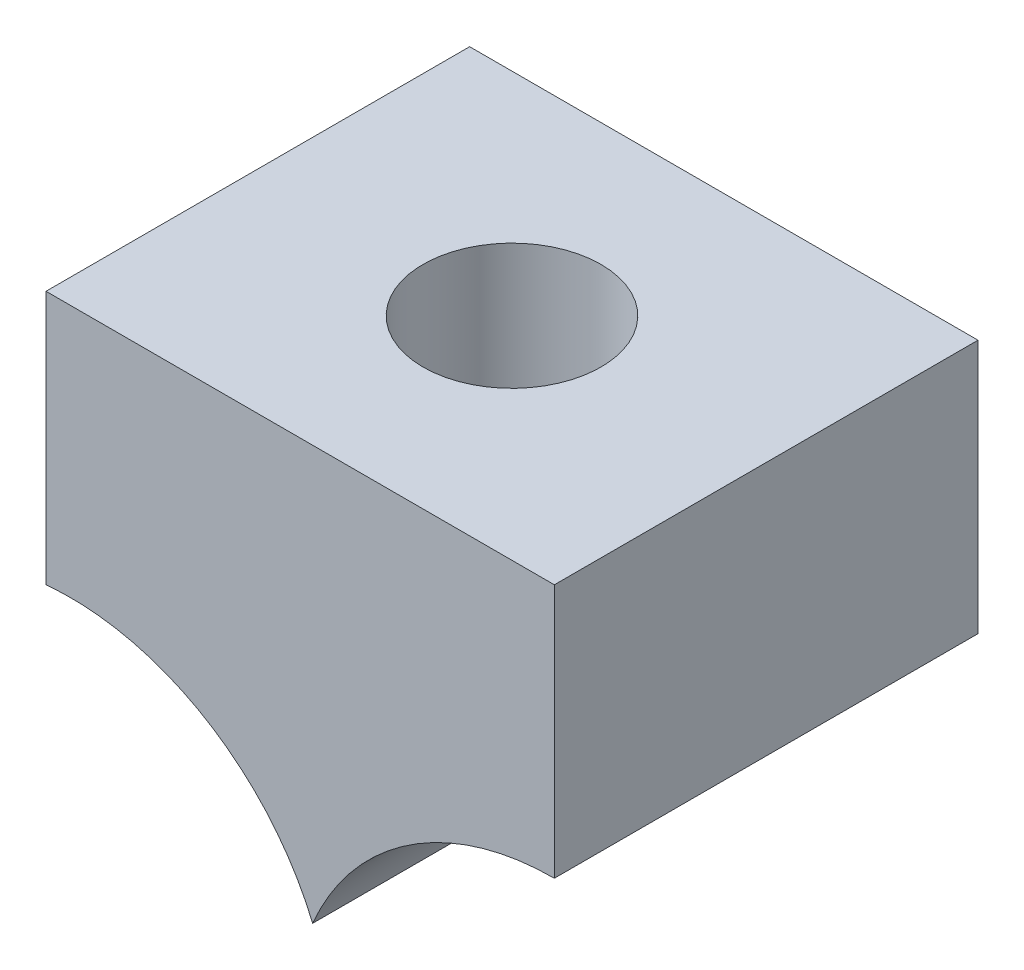
ISO-10303-21;
HEADER;
FILE_DESCRIPTION(('STEP AP214'),'2;1');
FILE_NAME('part.step','',(''),(''),'','','');
FILE_SCHEMA(('AUTOMOTIVE_DESIGN { 1 0 10303 214 1 1 1 1 }'));
ENDSEC;
DATA;
#1=APPLICATION_CONTEXT('core data for automotive mechanical design processes');
#2=APPLICATION_PROTOCOL_DEFINITION('international standard','automotive_design',2000,#1);
#3=PRODUCT_CONTEXT('',#1,'mechanical');
#4=PRODUCT('Part','Part','',(#3));
#5=PRODUCT_RELATED_PRODUCT_CATEGORY('part','',(#4));
#6=PRODUCT_DEFINITION_FORMATION('','',#4);
#7=PRODUCT_DEFINITION_CONTEXT('part definition',#1,'design');
#8=PRODUCT_DEFINITION('design','',#6,#7);
#9=PRODUCT_DEFINITION_SHAPE('','',#8);
#10=(LENGTH_UNIT() NAMED_UNIT(*) SI_UNIT(.MILLI.,.METRE.));
#11=(NAMED_UNIT(*) PLANE_ANGLE_UNIT() SI_UNIT($,.RADIAN.));
#12=(NAMED_UNIT(*) SI_UNIT($,.STERADIAN.) SOLID_ANGLE_UNIT());
#13=UNCERTAINTY_MEASURE_WITH_UNIT(LENGTH_MEASURE(1.E-05),#10,'distance_accuracy_value','');
#14=(GEOMETRIC_REPRESENTATION_CONTEXT(3) GLOBAL_UNCERTAINTY_ASSIGNED_CONTEXT((#13)) GLOBAL_UNIT_ASSIGNED_CONTEXT((#10,
#11,#12)) REPRESENTATION_CONTEXT('',''));
#15=CARTESIAN_POINT('',(0.,0.,0.));
#16=DIRECTION('',(0.,0.,1.));
#17=DIRECTION('',(1.,0.,0.));
#18=AXIS2_PLACEMENT_3D('',#15,#16,#17);
#19=CARTESIAN_POINT('',(6.,-9.2,10.));
#20=DIRECTION('',(0.,0.,-1.));
#21=DIRECTION('',(-1.,0.,0.));
#22=AXIS2_PLACEMENT_3D('',#19,#20,#21);
#23=CYLINDRICAL_SURFACE('',#22,6.2);
#24=DIRECTION('',(0.,0.,-1.));
#25=VECTOR('',#24,1.);
#26=CARTESIAN_POINT('',(0.294538659958557,-6.77353943009731,10.));
#27=LINE('',#26,#25);
#28=CARTESIAN_POINT('',(0.294538659958557,-6.77353943009731,10.));
#29=VERTEX_POINT('',#28);
#30=CARTESIAN_POINT('',(0.294538659958557,-6.77353943009731,5.95563956478885));
#31=VERTEX_POINT('',#30);
#32=EDGE_CURVE('E134',#29,#31,#27,.T.);
#33=ORIENTED_EDGE('',*,*,#32,.T.);
#34=CARTESIAN_POINT('',(0.294538659958557,-6.77353943009731,5.95563956478885));
#35=CARTESIAN_POINT('',(0.319577944758223,-6.71464476142328,5.94789611568546));
#36=CARTESIAN_POINT('',(0.345496042168241,-6.65625215897637,5.93885291879536));
#37=CARTESIAN_POINT('',(0.398968645232684,-6.5405829661307,5.91742627537983));
#38=CARTESIAN_POINT('',(0.426528841136147,-6.48331129404149,5.90503061557918));
#39=CARTESIAN_POINT('',(0.483398606951488,-6.36959110537852,5.87598936619471));
#40=CARTESIAN_POINT('',(0.512728184319496,-6.31316773397476,5.85928295153813));
#41=CARTESIAN_POINT('',(0.572301193591712,-6.20266568486591,5.82080967898042));
#42=CARTESIAN_POINT('',(0.602543024400263,-6.14858326346055,5.79905128402627));
#43=CARTESIAN_POINT('',(0.661408428799989,-6.04679939375127,5.75092706085191));
#44=CARTESIAN_POINT('',(0.690013206225535,-5.99891074403033,5.72494025364737));
#45=CARTESIAN_POINT('',(0.746567793630416,-5.90692425189527,5.66654637699395));
#46=CARTESIAN_POINT('',(0.774519195930949,-5.86281629383269,5.63415725859096));
#47=CARTESIAN_POINT('',(0.824577994470092,-5.78579347011669,5.56706324180285));
#48=CARTESIAN_POINT('',(0.84694679125584,-5.75218179016361,5.53336625913984));
#49=CARTESIAN_POINT('',(0.888959413884326,-5.69020521410956,5.45992608251469));
#50=CARTESIAN_POINT('',(0.908607574896666,-5.66183194628948,5.42019272409949));
#51=CARTESIAN_POINT('',(0.938632823125443,-5.61907136000634,5.34653114062608));
#52=CARTESIAN_POINT('',(0.950071921780729,-5.60298537378479,5.31402831367237));
#53=CARTESIAN_POINT('',(0.969850817171324,-5.57537752576799,5.24623651746745));
#54=CARTESIAN_POINT('',(0.978192761917918,-5.56385250038054,5.21094949984573));
#55=CARTESIAN_POINT('',(0.991115422719841,-5.54607056157417,5.13808534198017));
#56=CARTESIAN_POINT('',(0.995666976973264,-5.5398544839793,5.1004927923198));
#57=CARTESIAN_POINT('',(1.00042163069192,-5.53336198898033,5.02452829981438));
#58=CARTESIAN_POINT('',(1.00062713563549,-5.53308228587455,4.98615679988097));
#59=CARTESIAN_POINT('',(0.996904606617828,-5.53816409076426,4.91442084601986));
#60=CARTESIAN_POINT('',(0.993444089518756,-5.54288754940048,4.8809833189595));
#61=CARTESIAN_POINT('',(0.983393704210935,-5.55668647738826,4.81551653677775));
#62=CARTESIAN_POINT('',(0.976803231714106,-5.56576278713085,4.78348755490381));
#63=CARTESIAN_POINT('',(0.960701314289487,-5.5881220267725,4.72045057268864));
#64=CARTESIAN_POINT('',(0.951099110362528,-5.60153613171745,4.68951310683908));
#65=CARTESIAN_POINT('',(0.929658862736607,-5.63180908363007,4.6302299945422));
#66=CARTESIAN_POINT('',(0.917819836816344,-5.64866944416626,4.60188549485035));
#67=CARTESIAN_POINT('',(0.884596801529852,-5.69658228705679,4.53114387577295));
#68=CARTESIAN_POINT('',(0.861850588696447,-5.729946531147,4.49094931230405));
#69=CARTESIAN_POINT('',(0.813921546858244,-5.80198830361521,4.41736035106639));
#70=CARTESIAN_POINT('',(0.788732434758009,-5.84067964639998,4.38398421300209));
#71=CARTESIAN_POINT('',(0.72141937570362,-5.9469136149233,4.30450659763101));
#72=CARTESIAN_POINT('',(0.67843979163503,-6.01752285436015,4.26326743506472));
#73=CARTESIAN_POINT('',(0.592994183525895,-6.16493167203367,4.19288812306602));
#74=CARTESIAN_POINT('',(0.550531116198749,-6.24175626961,4.16380010765258));
#75=CARTESIAN_POINT('',(0.470838132267329,-6.39372230274949,4.11665983082904));
#76=CARTESIAN_POINT('',(0.433451463312083,-6.46858767217031,4.09796452196227));
#77=CARTESIAN_POINT('',(0.379568557112988,-6.58227417112616,4.07463363303096));
#78=CARTESIAN_POINT('',(0.362070029717307,-6.62017498530235,4.06766933691374));
#79=CARTESIAN_POINT('',(0.32777217213031,-6.69648648749993,4.05506729906284));
#80=CARTESIAN_POINT('',(0.310972481321731,-6.7348968987135,4.04942886598193));
#81=CARTESIAN_POINT('',(0.294538659958559,-6.77353943009731,4.04436043521115));
#82=B_SPLINE_CURVE_WITH_KNOTS('',3,(#34,#35,#36,#37,#38,#39,#40,#41,#42,#43,#44,#45,#46,#47,#48,
#49,#50,#51,#52,#53,#54,#55,#56,#57,#58,#59,#60,#61,#62,#63,#64,#65,#66,#67,#68,#69,#70,#71,#72,
#73,#74,#75,#76,#77,#78,#79,#80,#81),.UNSPECIFIED.,.F.,.F.,(4,2,2,2,2,2,2,2,2,2,2,2,2,2,2,2,2,2,
2,2,2,2,2,4),(0.,0.193427397392866,0.387569185194656,0.584616349733678,0.781335777574818,
0.96559786936719,1.14935046676908,1.3065981757159,1.46359236325719,1.57724752563359,
1.69082371529794,1.80526584826193,1.91964463742554,2.02101323525923,2.12240141188716,
2.22719846958341,2.33204165260733,2.50198467692784,2.6723770082314,2.94794881138079,
3.22469109368673,3.48153760725996,3.6084814320951,3.73535891686298),.UNSPECIFIED.);
#83=CARTESIAN_POINT('',(0.294538659958557,-6.77353943009731,4.04436043521115));
#84=VERTEX_POINT('',#83);
#85=EDGE_CURVE('E52',#31,#84,#82,.T.);
#86=ORIENTED_EDGE('',*,*,#85,.T.);
#87=CARTESIAN_POINT('',(0.294538659958557,-6.77353943009731,0.));
#88=VERTEX_POINT('',#87);
#89=EDGE_CURVE('E85',#84,#88,#27,.T.);
#90=ORIENTED_EDGE('',*,*,#89,.T.);
#91=CARTESIAN_POINT('',(6.,-9.2,0.));
#92=DIRECTION('',(0.,0.,-1.));
#93=DIRECTION('',(1.,0.,0.));
#94=AXIS2_PLACEMENT_3D('',#91,#92,#93);
#95=CIRCLE('',#94,6.2);
#96=CARTESIAN_POINT('',(6.,-3.,0.));
#97=VERTEX_POINT('',#96);
#98=EDGE_CURVE('E123',#88,#97,#95,.T.);
#99=ORIENTED_EDGE('',*,*,#98,.T.);
#100=DIRECTION('',(0.,0.,-1.));
#101=VECTOR('',#100,1.);
#102=CARTESIAN_POINT('',(6.,-3.,10.));
#103=LINE('',#102,#101);
#104=CARTESIAN_POINT('',(6.,-3.,10.));
#105=VERTEX_POINT('',#104);
#106=EDGE_CURVE('E11',#105,#97,#103,.T.);
#107=ORIENTED_EDGE('',*,*,#106,.F.);
#108=CARTESIAN_POINT('',(6.,-9.2,10.));
#109=DIRECTION('',(0.,0.,-1.));
#110=DIRECTION('',(1.,0.,0.));
#111=AXIS2_PLACEMENT_3D('',#108,#109,#110);
#112=CIRCLE('',#111,6.2);
#113=EDGE_CURVE('E133',#29,#105,#112,.T.);
#114=ORIENTED_EDGE('',*,*,#113,.F.);
#115=EDGE_LOOP('',(#33,#86,#90,#99,#107,#114));
#116=FACE_BOUND('',#115,.T.);
#117=ADVANCED_FACE('F33',(#116),#23,.F.);
#118=CARTESIAN_POINT('',(6.,3.,10.));
#119=DIRECTION('',(-1.,0.,0.));
#120=DIRECTION('',(0.,-1.,0.));
#121=AXIS2_PLACEMENT_3D('',#118,#119,#120);
#122=PLANE('',#121);
#123=DIRECTION('',(0.,1.,0.));
#124=VECTOR('',#123,1.);
#125=CARTESIAN_POINT('',(6.,3.,0.));
#126=LINE('',#125,#124);
#127=CARTESIAN_POINT('',(6.,3.,0.));
#128=VERTEX_POINT('',#127);
#129=EDGE_CURVE('E125',#97,#128,#126,.T.);
#130=ORIENTED_EDGE('',*,*,#129,.T.);
#131=DIRECTION('',(0.,0.,-1.));
#132=VECTOR('',#131,1.);
#133=CARTESIAN_POINT('',(6.,3.,10.));
#134=LINE('',#133,#132);
#135=CARTESIAN_POINT('',(6.,3.,10.));
#136=VERTEX_POINT('',#135);
#137=EDGE_CURVE('E46',#136,#128,#134,.T.);
#138=ORIENTED_EDGE('',*,*,#137,.F.);
#139=DIRECTION('',(0.,1.,0.));
#140=VECTOR('',#139,1.);
#141=CARTESIAN_POINT('',(6.,3.,10.));
#142=LINE('',#141,#140);
#143=EDGE_CURVE('E93',#105,#136,#142,.T.);
#144=ORIENTED_EDGE('',*,*,#143,.F.);
#145=ORIENTED_EDGE('',*,*,#106,.T.);
#146=EDGE_LOOP('',(#130,#138,#144,#145));
#147=FACE_BOUND('',#146,.T.);
#148=ADVANCED_FACE('F190',(#147),#122,.F.);
#149=CARTESIAN_POINT('',(-6.,3.,10.));
#150=DIRECTION('',(0.,-1.,0.));
#151=DIRECTION('',(0.,0.,-1.));
#152=AXIS2_PLACEMENT_3D('',#149,#150,#151);
#153=PLANE('',#152);
#154=CARTESIAN_POINT('',(0.,3.,5.));
#155=DIRECTION('',(0.,1.,0.));
#156=DIRECTION('',(0.,0.,1.));
#157=AXIS2_PLACEMENT_3D('',#154,#155,#156);
#158=CIRCLE('',#157,2.1);
#159=CARTESIAN_POINT('',(0.,3.,7.1));
#160=VERTEX_POINT('',#159);
#161=EDGE_CURVE('E149',#160,#160,#158,.T.);
#162=ORIENTED_EDGE('',*,*,#161,.F.);
#163=EDGE_LOOP('',(#162));
#164=FACE_BOUND('',#163,.T.);
#165=DIRECTION('',(-1.,0.,0.));
#166=VECTOR('',#165,1.);
#167=CARTESIAN_POINT('',(-6.,3.,0.));
#168=LINE('',#167,#166);
#169=CARTESIAN_POINT('',(-6.,3.,0.));
#170=VERTEX_POINT('',#169);
#171=EDGE_CURVE('E112',#128,#170,#168,.T.);
#172=ORIENTED_EDGE('',*,*,#171,.T.);
#173=DIRECTION('',(0.,0.,-1.));
#174=VECTOR('',#173,1.);
#175=CARTESIAN_POINT('',(-6.,3.,10.));
#176=LINE('',#175,#174);
#177=CARTESIAN_POINT('',(-6.,3.,10.));
#178=VERTEX_POINT('',#177);
#179=EDGE_CURVE('E109',#178,#170,#176,.T.);
#180=ORIENTED_EDGE('',*,*,#179,.F.);
#181=DIRECTION('',(-1.,0.,0.));
#182=VECTOR('',#181,1.);
#183=CARTESIAN_POINT('',(-6.,3.,10.));
#184=LINE('',#183,#182);
#185=EDGE_CURVE('E99',#136,#178,#184,.T.);
#186=ORIENTED_EDGE('',*,*,#185,.F.);
#187=ORIENTED_EDGE('',*,*,#137,.T.);
#188=EDGE_LOOP('',(#172,#180,#186,#187));
#189=FACE_BOUND('',#188,.T.);
#190=ADVANCED_FACE('F110',(#164,#189),#153,.F.);
#191=CARTESIAN_POINT('',(-6.,3.,10.));
#192=DIRECTION('',(1.,0.,0.));
#193=DIRECTION('',(0.,1.,0.));
#194=AXIS2_PLACEMENT_3D('',#191,#192,#193);
#195=PLANE('',#194);
#196=DIRECTION('',(0.,-1.,0.));
#197=VECTOR('',#196,1.);
#198=CARTESIAN_POINT('',(-6.,3.,0.));
#199=LINE('',#198,#197);
#200=CARTESIAN_POINT('',(-6.,-3.,0.));
#201=VERTEX_POINT('',#200);
#202=EDGE_CURVE('E129',#170,#201,#199,.T.);
#203=ORIENTED_EDGE('',*,*,#202,.T.);
#204=DIRECTION('',(0.,0.,-1.));
#205=VECTOR('',#204,1.);
#206=CARTESIAN_POINT('',(-6.,-3.,10.));
#207=LINE('',#206,#205);
#208=CARTESIAN_POINT('',(-6.,-3.,10.));
#209=VERTEX_POINT('',#208);
#210=EDGE_CURVE('E115',#209,#201,#207,.T.);
#211=ORIENTED_EDGE('',*,*,#210,.F.);
#212=DIRECTION('',(0.,-1.,0.));
#213=VECTOR('',#212,1.);
#214=CARTESIAN_POINT('',(-6.,3.,10.));
#215=LINE('',#214,#213);
#216=EDGE_CURVE('E103',#178,#209,#215,.T.);
#217=ORIENTED_EDGE('',*,*,#216,.F.);
#218=ORIENTED_EDGE('',*,*,#179,.T.);
#219=EDGE_LOOP('',(#203,#211,#217,#218));
#220=FACE_BOUND('',#219,.T.);
#221=ADVANCED_FACE('F117',(#220),#195,.F.);
#222=CARTESIAN_POINT('',(-5.42231809297083,-9.17302872294396,10.));
#223=DIRECTION('',(0.,0.,-1.));
#224=DIRECTION('',(-1.,0.,0.));
#225=AXIS2_PLACEMENT_3D('',#222,#223,#224);
#226=CYLINDRICAL_SURFACE('',#225,6.2);
#227=CARTESIAN_POINT('',(-4.66126921297112,-3.01991531564597,4.40824026154651));
#228=CARTESIAN_POINT('',(-4.69329567778528,-3.01595416454886,4.4358970277704));
#229=CARTESIAN_POINT('',(-4.72297300807525,-3.01253812217834,4.46640556654356));
#230=CARTESIAN_POINT('',(-4.77681181372167,-3.00666348610202,4.53207624256714));
#231=CARTESIAN_POINT('',(-4.80096441769976,-3.00420642788766,4.56724572314144));
#232=CARTESIAN_POINT('',(-4.84286729931474,-3.00013036400783,4.6405684692015));
#233=CARTESIAN_POINT('',(-4.86070546565399,-2.99849970528302,4.67867098196693));
#234=CARTESIAN_POINT('',(-4.89012415211136,-2.99589440355303,4.7572207198254));
#235=CARTESIAN_POINT('',(-4.90170600624415,-2.99491962068651,4.7976674430312));
#236=CARTESIAN_POINT('',(-4.9188775949125,-2.9934957907162,4.88207665001824));
#237=CARTESIAN_POINT('',(-4.92411475803221,-2.99307755973027,4.92611158729405));
#238=CARTESIAN_POINT('',(-4.92735604214689,-2.99281716400115,5.01445699710422));
#239=CARTESIAN_POINT('',(-4.92535803132236,-2.99297516904405,5.05876754700713));
#240=CARTESIAN_POINT('',(-4.91400920747406,-2.99389806493825,5.14762248682612));
#241=CARTESIAN_POINT('',(-4.9044666609037,-2.99467878586297,5.19214245364442));
#242=CARTESIAN_POINT('',(-4.87796406243987,-2.99695760698661,5.27890554074679));
#243=CARTESIAN_POINT('',(-4.86100419546976,-2.99845568930087,5.32114871776467));
#244=CARTESIAN_POINT('',(-4.82033676831108,-3.00228910835665,5.40139706814674));
#245=CARTESIAN_POINT('',(-4.79673783943714,-3.00461111169355,5.43945776854262));
#246=CARTESIAN_POINT('',(-4.7432508689245,-3.01027060094783,5.51078682830367));
#247=CARTESIAN_POINT('',(-4.7133649281641,-3.01360774780891,5.54405678231231));
#248=CARTESIAN_POINT('',(-4.64976173658251,-3.02127053288189,5.6030752381873));
#249=CARTESIAN_POINT('',(-4.61630779850517,-3.02553897947044,5.62911480278371));
#250=CARTESIAN_POINT('',(-4.54545431135818,-3.03524537829669,5.67482559878119));
#251=CARTESIAN_POINT('',(-4.50805617906667,-3.04068291131557,5.69449910664712));
#252=CARTESIAN_POINT('',(-4.4324320179435,-3.05244736404963,5.72598959953547));
#253=CARTESIAN_POINT('',(-4.39433840929421,-3.05871699742117,5.73814702234865));
#254=CARTESIAN_POINT('',(-4.31680768237432,-3.07225878610308,5.75575653907631));
#255=CARTESIAN_POINT('',(-4.27737068835067,-3.07953084888934,5.76120925137454));
#256=CARTESIAN_POINT('',(-4.19876994431795,-3.09482872808821,5.76532980444298));
#257=CARTESIAN_POINT('',(-4.15960826135135,-3.10284492360911,5.76407488499544));
#258=CARTESIAN_POINT('',(-4.08215733444018,-3.11947280669162,5.75514274922362));
#259=CARTESIAN_POINT('',(-4.04386821897744,-3.12808458120602,5.7474645933022));
#260=CARTESIAN_POINT('',(-3.96784566941427,-3.14591616480121,5.72567711201621));
#261=CARTESIAN_POINT('',(-3.93017456566923,-3.15514668537786,5.71135955136748));
#262=CARTESIAN_POINT('',(-3.85767716071564,-3.17358706639607,5.67675311761683));
#263=CARTESIAN_POINT('',(-3.82285162815743,-3.18279692060611,5.65646263786804));
#264=CARTESIAN_POINT('',(-3.75520492843197,-3.20125983774145,5.60935811899449));
#265=CARTESIAN_POINT('',(-3.72256799463183,-3.21049252306067,5.58227114059485));
#266=CARTESIAN_POINT('',(-3.66211916949499,-3.22805667100203,5.52290924252094));
#267=CARTESIAN_POINT('',(-3.63430812860914,-3.23638797467952,5.49063341035921));
#268=CARTESIAN_POINT('',(-3.58372130967229,-3.25185669268269,5.42097677921112));
#269=CARTESIAN_POINT('',(-3.56106693165675,-3.25896451594099,5.38350097229713));
#270=CARTESIAN_POINT('',(-3.52230108802854,-3.27130426465577,5.30502076173876));
#271=CARTESIAN_POINT('',(-3.50618842175746,-3.27653653432858,5.26401700728572));
#272=CARTESIAN_POINT('',(-3.48138192456975,-3.28465590846626,5.18066868427334));
#273=CARTESIAN_POINT('',(-3.47252099928887,-3.28759575473225,5.13837908160012));
#274=CARTESIAN_POINT('',(-3.46192552101485,-3.29111633254143,5.05282354177359));
#275=CARTESIAN_POINT('',(-3.46018930279193,-3.29169761534203,5.00955783513855));
#276=CARTESIAN_POINT('',(-3.46384599493103,-3.29047914621729,4.92480011859433));
#277=CARTESIAN_POINT('',(-3.46900568900911,-3.2887572839163,4.88329666928403));
#278=CARTESIAN_POINT('',(-3.48585638511103,-3.28319054111716,4.80178823863283));
#279=CARTESIAN_POINT('',(-3.49754757602432,-3.27934559922005,4.76178330066425));
#280=CARTESIAN_POINT('',(-3.52711890840025,-3.26977023158359,4.68419564163808));
#281=CARTESIAN_POINT('',(-3.54502323607337,-3.26403244182671,4.64662307760854));
#282=CARTESIAN_POINT('',(-3.58646172676906,-3.25102724417028,4.57501365422918));
#283=CARTESIAN_POINT('',(-3.6099970114304,-3.2437595315578,4.54097750124216));
#284=CARTESIAN_POINT('',(-3.66297725026679,-3.22781974116112,4.4761427699653));
#285=CARTESIAN_POINT('',(-3.69260078753165,-3.21910729268029,4.44549996095745));
#286=CARTESIAN_POINT('',(-3.75642718897189,-3.20093468753313,4.38968454323422));
#287=CARTESIAN_POINT('',(-3.79063087682501,-3.19147439650316,4.36451292057804));
#288=CARTESIAN_POINT('',(-3.86346521332132,-3.17207687013435,4.31994340541633));
#289=CARTESIAN_POINT('',(-3.90216873048876,-3.16213394758829,4.30066668868794));
#290=CARTESIAN_POINT('',(-3.98241653844766,-3.14240787234844,4.26925982362432));
#291=CARTESIAN_POINT('',(-4.02396029266645,-3.13262468990708,4.25712832956696));
#292=CARTESIAN_POINT('',(-4.10752835755147,-3.11389425681663,4.24080784118688));
#293=CARTESIAN_POINT('',(-4.14950818860722,-3.10493143311458,4.23641000585334));
#294=CARTESIAN_POINT('',(-4.2337582763399,-3.08786887333919,4.23524786083606));
#295=CARTESIAN_POINT('',(-4.27602849288308,-3.07976902045262,4.23848251662953));
#296=CARTESIAN_POINT('',(-4.35735817288694,-3.06504341686019,4.25226535030622));
#297=CARTESIAN_POINT('',(-4.39647215932878,-3.05836399293115,4.26243725103484));
#298=CARTESIAN_POINT('',(-4.47247398002543,-3.04609842418974,4.28943692711698));
#299=CARTESIAN_POINT('',(-4.50936471633619,-3.04051083182862,4.30625579921317));
#300=CARTESIAN_POINT('',(-4.56530281778093,-3.03251029793214,4.33779274064392));
#301=CARTESIAN_POINT('',(-4.5854448254246,-3.02973727382701,4.35052626872506));
#302=CARTESIAN_POINT('',(-4.62439665172766,-3.02455682170084,4.3779509895065));
#303=CARTESIAN_POINT('',(-4.64320654674423,-3.02214937271585,4.39264206985984));
#304=CARTESIAN_POINT('',(-4.66126921297112,-3.01991531564597,4.40824026154651));
#305=B_SPLINE_CURVE_WITH_KNOTS('',3,(#227,#228,#229,#230,#231,#232,#233,#234,#235,#236,#237,
#238,#239,#240,#241,#242,#243,#244,#245,#246,#247,#248,#249,#250,#251,#252,#253,#254,#255,#256,
#257,#258,#259,#260,#261,#262,#263,#264,#265,#266,#267,#268,#269,#270,#271,#272,#273,#274,#275,
#276,#277,#278,#279,#280,#281,#282,#283,#284,#285,#286,#287,#288,#289,#290,#291,#292,#293,#294,
#295,#296,#297,#298,#299,#300,#301,#302,#303,#304),.UNSPECIFIED.,.T.,.F.,(4,2,2,2,2,2,2,2,2,2,2,
2,2,2,2,2,2,2,2,2,2,2,2,2,2,2,2,2,2,2,2,2,2,2,2,2,2,2,4),(0.,0.127408664673281,
0.255020502789959,0.380778991102642,0.506510653714916,0.638948835894178,0.771426043710172,
0.907382592204781,1.04333575132048,1.17718224467225,1.31098408250343,1.43815416238272,
1.5652787165967,1.68611609239372,1.80694232237378,1.92638023219142,2.0458356165558,
2.16932119012752,2.29284001030453,2.42246589612953,2.55211460233933,2.68455670999937,
2.81697449838303,2.94624765136962,3.07549058812868,3.2004713494224,3.32545572531948,
3.45093219597188,3.57643368131005,3.70634467350045,3.83627905986859,3.96872824034755,
4.10115246753327,4.2299423684577,4.35871481394958,4.48100624588923,4.60313442725599,
4.67499600254855,4.74685345536961),.UNSPECIFIED.);
#306=CARTESIAN_POINT('',(-4.66126921297112,-3.01991531564597,4.40824026154651));
#307=VERTEX_POINT('',#306);
#308=EDGE_CURVE('E37',#307,#307,#305,.T.);
#309=ORIENTED_EDGE('',*,*,#308,.T.);
#310=EDGE_LOOP('',(#309));
#311=FACE_BOUND('',#310,.T.);
#312=ORIENTED_EDGE('',*,*,#89,.F.);
#313=CARTESIAN_POINT('',(0.294538659958557,-6.77353943009731,4.04436043521115));
#314=CARTESIAN_POINT('',(0.274214524959473,-6.72511731889461,4.03809819853893));
#315=CARTESIAN_POINT('',(0.253252994492904,-6.67689956474498,4.03234556707236));
#316=CARTESIAN_POINT('',(0.210051646651384,-6.58088958505522,4.02205714407994));
#317=CARTESIAN_POINT('',(0.187811389942628,-6.53309751235919,4.01752177384044));
#318=CARTESIAN_POINT('',(0.118901189748133,-6.38983668714217,4.00599613205084));
#319=CARTESIAN_POINT('',(0.0702976494523316,-6.29509374360286,4.00117029866506));
#320=CARTESIAN_POINT('',(-0.0324964672297027,-6.106843979938,3.99918681333587));
#321=CARTESIAN_POINT('',(-0.0867558563533364,-6.01337314617973,4.00213768441695));
#322=CARTESIAN_POINT('',(-0.199570062518356,-5.83021671516491,4.01846405285213));
#323=CARTESIAN_POINT('',(-0.258110896186284,-5.74052018093384,4.03180687619709));
#324=CARTESIAN_POINT('',(-0.338384605272802,-5.62409887814329,4.05875156453519));
#325=CARTESIAN_POINT('',(-0.358802997678861,-5.59503165982675,4.06632300575815));
#326=CARTESIAN_POINT('',(-0.399895321859164,-5.53757603195648,4.08316980428829));
#327=CARTESIAN_POINT('',(-0.420569277056544,-5.50918768533379,4.09244531887546));
#328=CARTESIAN_POINT('',(-0.482760075952446,-5.42528358388809,4.1230297918897));
#329=CARTESIAN_POINT('',(-0.524525423966151,-5.3709136887491,4.1471219304201));
#330=CARTESIAN_POINT('',(-0.607914039153886,-5.2658483744994,4.20436928637767));
#331=CARTESIAN_POINT('',(-0.649531131501908,-5.21519790107766,4.23761766560593));
#332=CARTESIAN_POINT('',(-0.730151056113678,-5.11995161221492,4.31446068077652));
#333=CARTESIAN_POINT('',(-0.769159024908018,-5.07534371195446,4.35803417216453));
#334=CARTESIAN_POINT('',(-0.82955681361739,-5.00795025396973,4.44008586692258));
#335=CARTESIAN_POINT('',(-0.8525081753808,-4.98282532532665,4.47548734065016));
#336=CARTESIAN_POINT('',(-0.894700500368116,-4.93727148079366,4.55123888145927));
#337=CARTESIAN_POINT('',(-0.913942916220878,-4.9168407258006,4.59158700098885));
#338=CARTESIAN_POINT('',(-0.947555695784535,-4.88151296443168,4.67709701968075));
#339=CARTESIAN_POINT('',(-0.961877019038505,-4.86667152499776,4.7223017938877));
#340=CARTESIAN_POINT('',(-0.984080495888549,-4.84378994301128,4.81590889310176));
#341=CARTESIAN_POINT('',(-0.991969976442451,-4.8357420610748,4.86430751161988));
#342=CARTESIAN_POINT('',(-0.999902678317047,-4.82765568770188,4.9554422130429));
#343=CARTESIAN_POINT('',(-1.00089682346077,-4.82664638951198,4.99801243377507));
#344=CARTESIAN_POINT('',(-0.997473879805411,-4.83013104973066,5.08270022639985));
#345=CARTESIAN_POINT('',(-0.993058211163613,-4.83462356383084,5.12481791416169));
#346=CARTESIAN_POINT('',(-0.979632179831777,-4.84837560446026,5.2045748866372));
#347=CARTESIAN_POINT('',(-0.970940667785983,-4.85730470069111,5.24232701976827));
#348=CARTESIAN_POINT('',(-0.949707644687775,-4.87931371367201,5.31544538922202));
#349=CARTESIAN_POINT('',(-0.937165586740258,-4.89239422005798,5.35081128575532));
#350=CARTESIAN_POINT('',(-0.907669945268975,-4.92350549614218,5.42158264635756));
#351=CARTESIAN_POINT('',(-0.890425467014574,-4.94187036072114,5.45671826219534));
#352=CARTESIAN_POINT('',(-0.853084423850771,-4.98222174649272,5.52316604944776));
#353=CARTESIAN_POINT('',(-0.832986001217583,-5.00421062818384,5.55447570552753));
#354=CARTESIAN_POINT('',(-0.778440955339235,-5.0648807017104,5.63032251811891));
#355=CARTESIAN_POINT('',(-0.742453421326605,-5.10582676264983,5.67194781132951));
#356=CARTESIAN_POINT('',(-0.66792048885715,-5.1932004592337,5.74609501988003));
#357=CARTESIAN_POINT('',(-0.629370202968044,-5.23963870847696,5.77859888564981));
#358=CARTESIAN_POINT('',(-0.531093526992826,-5.36188404949828,5.85050141494214));
#359=CARTESIAN_POINT('',(-0.470836097329972,-5.44034939796185,5.8846160980117));
#360=CARTESIAN_POINT('',(-0.351843727293682,-5.60362670100064,5.93834800111812));
#361=CARTESIAN_POINT('',(-0.293120743845437,-5.68847546294244,5.95787270572009));
#362=CARTESIAN_POINT('',(-0.184210398973459,-5.85471015228831,5.98433794734905));
#363=CARTESIAN_POINT('',(-0.13372414456828,-5.93576035299736,5.99222125619965));
#364=CARTESIAN_POINT('',(-0.0363422222493756,-6.10049842504309,6.0005349858988));
#365=CARTESIAN_POINT('',(0.0105471787982848,-6.18419055683306,6.0009526803313));
#366=CARTESIAN_POINT('',(0.0992558429538071,-6.35150832665623,5.99603111258559));
#367=CARTESIAN_POINT('',(0.141168117192181,-6.43508963434474,5.99082642361037));
#368=CARTESIAN_POINT('',(0.220894760034834,-6.60343579588615,5.97612823231066));
#369=CARTESIAN_POINT('',(0.258724032233114,-6.68819497575096,5.96665103022785));
#370=CARTESIAN_POINT('',(0.294538659958557,-6.77353943009731,5.95563956478885));
#371=B_SPLINE_CURVE_WITH_KNOTS('',3,(#313,#314,#315,#316,#317,#318,#319,#320,#321,#322,#323,
#324,#325,#326,#327,#328,#329,#330,#331,#332,#333,#334,#335,#336,#337,#338,#339,#340,#341,#342,
#343,#344,#345,#346,#347,#348,#349,#350,#351,#352,#353,#354,#355,#356,#357,#358,#359,#360,#361,
#362,#363,#364,#365,#366,#367,#368,#369,#370),.UNSPECIFIED.,.F.,.F.,(4,2,2,2,2,2,2,2,2,2,2,2,2,
2,2,2,2,2,2,2,2,2,2,2,2,2,2,2,4),(0.,0.158645391701377,0.317345618967995,0.636743093668466,
0.960621244963904,1.28348516082318,1.39240565875723,1.50133621472609,1.71877294793028,
1.93850942998805,2.15779974971215,2.304603714123,2.45135006460839,2.59951904426238,
2.74751899757337,2.87461271469007,3.001673074947,3.12043668079396,3.23921716250931,
3.36843988667377,3.49774711495767,3.70233863675574,3.90733219652477,4.21953141127062,
4.53369387123385,4.82067001482409,5.10813531174144,5.38886945491172,5.66854150454026),.UNSPECIFIED.);
#372=EDGE_CURVE('E145',#84,#31,#371,.T.);
#373=ORIENTED_EDGE('',*,*,#372,.T.);
#374=ORIENTED_EDGE('',*,*,#32,.F.);
#375=CARTESIAN_POINT('',(-5.42231809297083,-9.17302872294396,10.));
#376=DIRECTION('',(0.,0.,-1.));
#377=DIRECTION('',(-1.,0.,0.));
#378=AXIS2_PLACEMENT_3D('',#375,#376,#377);
#379=CIRCLE('',#378,6.2);
#380=EDGE_CURVE('E61',#209,#29,#379,.T.);
#381=ORIENTED_EDGE('',*,*,#380,.F.);
#382=ORIENTED_EDGE('',*,*,#210,.T.);
#383=CARTESIAN_POINT('',(-5.42231809297083,-9.17302872294396,0.));
#384=DIRECTION('',(0.,0.,-1.));
#385=DIRECTION('',(-1.,0.,0.));
#386=AXIS2_PLACEMENT_3D('',#383,#384,#385);
#387=CIRCLE('',#386,6.2);
#388=EDGE_CURVE('E131',#201,#88,#387,.T.);
#389=ORIENTED_EDGE('',*,*,#388,.T.);
#390=EDGE_LOOP('',(#312,#373,#374,#381,#382,#389));
#391=FACE_BOUND('',#390,.T.);
#392=ADVANCED_FACE('F143',(#311,#391),#226,.F.);
#393=CARTESIAN_POINT('',(6.,-9.2,10.));
#394=DIRECTION('',(0.,0.,1.));
#395=DIRECTION('',(1.,0.,0.));
#396=AXIS2_PLACEMENT_3D('',#393,#394,#395);
#397=PLANE('',#396);
#398=ORIENTED_EDGE('',*,*,#113,.T.);
#399=ORIENTED_EDGE('',*,*,#143,.T.);
#400=ORIENTED_EDGE('',*,*,#185,.T.);
#401=ORIENTED_EDGE('',*,*,#216,.T.);
#402=ORIENTED_EDGE('',*,*,#380,.T.);
#403=EDGE_LOOP('',(#398,#399,#400,#401,#402));
#404=FACE_BOUND('',#403,.T.);
#405=ADVANCED_FACE('F101',(#404),#397,.T.);
#406=CARTESIAN_POINT('',(6.,-9.2,0.));
#407=DIRECTION('',(0.,0.,1.));
#408=DIRECTION('',(1.,0.,0.));
#409=AXIS2_PLACEMENT_3D('',#406,#407,#408);
#410=PLANE('',#409);
#411=ORIENTED_EDGE('',*,*,#98,.F.);
#412=ORIENTED_EDGE('',*,*,#388,.F.);
#413=ORIENTED_EDGE('',*,*,#202,.F.);
#414=ORIENTED_EDGE('',*,*,#171,.F.);
#415=ORIENTED_EDGE('',*,*,#129,.F.);
#416=EDGE_LOOP('',(#411,#412,#413,#414,#415));
#417=FACE_BOUND('',#416,.T.);
#418=ADVANCED_FACE('F140',(#417),#410,.F.);
#419=CARTESIAN_POINT('',(0.,-2.,5.));
#420=DIRECTION('',(0.,1.,0.));
#421=DIRECTION('',(0.,0.,1.));
#422=AXIS2_PLACEMENT_3D('',#419,#420,#421);
#423=CYLINDRICAL_SURFACE('',#422,2.1);
#424=CARTESIAN_POINT('',(0.,-2.,5.));
#425=DIRECTION('',(0.,1.,0.));
#426=DIRECTION('',(0.,0.,1.));
#427=AXIS2_PLACEMENT_3D('',#424,#425,#426);
#428=CIRCLE('',#427,2.1);
#429=CARTESIAN_POINT('',(0.,-2.,7.1));
#430=VERTEX_POINT('',#429);
#431=EDGE_CURVE('E126',#430,#430,#428,.T.);
#432=ORIENTED_EDGE('',*,*,#431,.F.);
#433=EDGE_LOOP('',(#432));
#434=FACE_BOUND('',#433,.T.);
#435=ORIENTED_EDGE('',*,*,#161,.T.);
#436=EDGE_LOOP('',(#435));
#437=FACE_BOUND('',#436,.T.);
#438=ADVANCED_FACE('F174',(#434,#437),#423,.F.);
#439=CARTESIAN_POINT('',(0.,-2.,5.));
#440=DIRECTION('',(0.,1.,0.));
#441=DIRECTION('',(0.,0.,1.));
#442=AXIS2_PLACEMENT_3D('',#439,#440,#441);
#443=PLANE('',#442);
#444=CARTESIAN_POINT('',(0.,-2.,5.));
#445=DIRECTION('',(0.,1.,0.));
#446=DIRECTION('',(0.,0.,1.));
#447=AXIS2_PLACEMENT_3D('',#444,#445,#446);
#448=CIRCLE('',#447,1.);
#449=CARTESIAN_POINT('',(0.,-2.,6.));
#450=VERTEX_POINT('',#449);
#451=EDGE_CURVE('E240',#450,#450,#448,.T.);
#452=ORIENTED_EDGE('',*,*,#451,.F.);
#453=EDGE_LOOP('',(#452));
#454=FACE_BOUND('',#453,.T.);
#455=ORIENTED_EDGE('',*,*,#431,.T.);
#456=EDGE_LOOP('',(#455));
#457=FACE_BOUND('',#456,.T.);
#458=ADVANCED_FACE('F168',(#454,#457),#443,.T.);
#459=CARTESIAN_POINT('',(0.,-6.77353943009731,5.));
#460=DIRECTION('',(0.,1.,0.));
#461=DIRECTION('',(0.,0.,1.));
#462=AXIS2_PLACEMENT_3D('',#459,#460,#461);
#463=CYLINDRICAL_SURFACE('',#462,1.);
#464=ORIENTED_EDGE('',*,*,#451,.T.);
#465=EDGE_LOOP('',(#464));
#466=FACE_BOUND('',#465,.T.);
#467=ORIENTED_EDGE('',*,*,#372,.F.);
#468=ORIENTED_EDGE('',*,*,#85,.F.);
#469=EDGE_LOOP('',(#467,#468));
#470=FACE_BOUND('',#469,.T.);
#471=ADVANCED_FACE('F163',(#466,#470),#463,.F.);
#472=CARTESIAN_POINT('',(-4.04459478976804,-2.85,5.));
#473=DIRECTION('',(0.,1.,0.));
#474=DIRECTION('',(0.,0.,1.));
#475=AXIS2_PLACEMENT_3D('',#472,#473,#474);
#476=CONICAL_SURFACE('',#475,1.02458889804283,0.78539816339745);
#477=CARTESIAN_POINT('',(-4.04459478976804,-3.87458889804283,5.));
#478=VERTEX_POINT('',#477);
#479=VERTEX_LOOP('',#478);
#480=FACE_BOUND('',#479,.T.);
#481=ORIENTED_EDGE('',*,*,#308,.F.);
#482=EDGE_LOOP('',(#481));
#483=FACE_BOUND('',#482,.T.);
#484=ADVANCED_FACE('F167',(#480,#483),#476,.T.);
#485=CLOSED_SHELL('',(#117,#148,#190,#221,#392,#405,#418,#438,#458,#471,#484));
#486=MANIFOLD_SOLID_BREP('B2',#485);
#487=ADVANCED_BREP_SHAPE_REPRESENTATION('',(#18,#486),#14);
#488=SHAPE_DEFINITION_REPRESENTATION(#9,#487);
ENDSEC;
END-ISO-10303-21;
